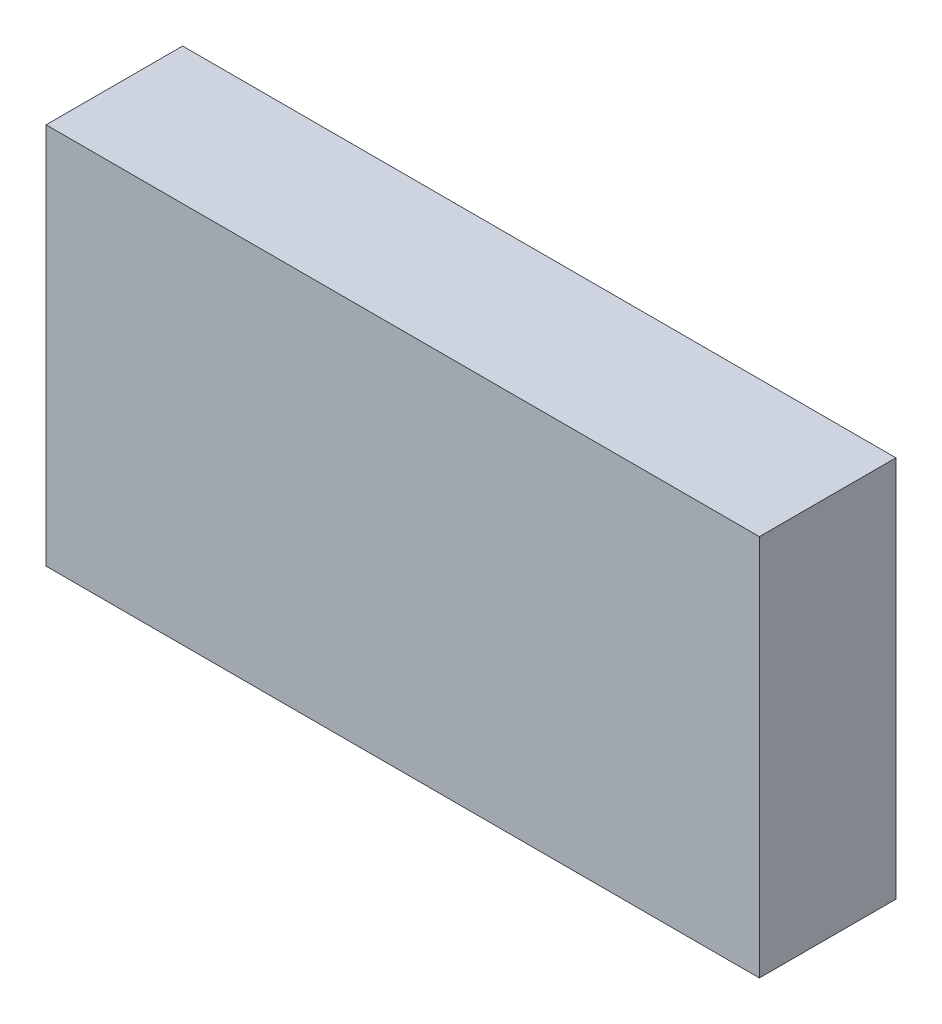
ISO-10303-21;
HEADER;
FILE_DESCRIPTION(('STEP AP214'),'2;1');
FILE_NAME('part.step','',(''),(''),'','','');
FILE_SCHEMA(('AUTOMOTIVE_DESIGN { 1 0 10303 214 1 1 1 1 }'));
ENDSEC;
DATA;
#1=APPLICATION_CONTEXT('core data for automotive mechanical design processes');
#2=APPLICATION_PROTOCOL_DEFINITION('international standard','automotive_design',2000,#1);
#3=PRODUCT_CONTEXT('',#1,'mechanical');
#4=PRODUCT('Part','Part','',(#3));
#5=PRODUCT_RELATED_PRODUCT_CATEGORY('part','',(#4));
#6=PRODUCT_DEFINITION_FORMATION('','',#4);
#7=PRODUCT_DEFINITION_CONTEXT('part definition',#1,'design');
#8=PRODUCT_DEFINITION('design','',#6,#7);
#9=PRODUCT_DEFINITION_SHAPE('','',#8);
#10=(LENGTH_UNIT() NAMED_UNIT(*) SI_UNIT(.MILLI.,.METRE.));
#11=(NAMED_UNIT(*) PLANE_ANGLE_UNIT() SI_UNIT($,.RADIAN.));
#12=(NAMED_UNIT(*) SI_UNIT($,.STERADIAN.) SOLID_ANGLE_UNIT());
#13=UNCERTAINTY_MEASURE_WITH_UNIT(LENGTH_MEASURE(1.E-05),#10,'distance_accuracy_value','');
#14=(GEOMETRIC_REPRESENTATION_CONTEXT(3) GLOBAL_UNCERTAINTY_ASSIGNED_CONTEXT((#13)) GLOBAL_UNIT_ASSIGNED_CONTEXT((#10,
#11,#12)) REPRESENTATION_CONTEXT('',''));
#15=CARTESIAN_POINT('',(0.,0.,0.));
#16=DIRECTION('',(0.,0.,1.));
#17=DIRECTION('',(1.,0.,0.));
#18=AXIS2_PLACEMENT_3D('',#15,#16,#17);
#19=CARTESIAN_POINT('',(-5.2250086,-2.79999948,2.));
#20=DIRECTION('',(0.,0.,-1.));
#21=DIRECTION('',(-1.,0.,0.));
#22=AXIS2_PLACEMENT_3D('',#19,#20,#21);
#23=PLANE('',#22);
#24=DIRECTION('',(0.,1.,0.));
#25=VECTOR('',#24,1.);
#26=CARTESIAN_POINT('',(5.22501114,-2.79999948,2.));
#27=LINE('',#26,#25);
#28=CARTESIAN_POINT('',(5.22501114,-2.79999948,2.));
#29=VERTEX_POINT('',#28);
#30=CARTESIAN_POINT('',(5.22501114,2.79999948,2.));
#31=VERTEX_POINT('',#30);
#32=EDGE_CURVE('E55',#29,#31,#27,.T.);
#33=ORIENTED_EDGE('',*,*,#32,.T.);
#34=DIRECTION('',(1.,0.,0.));
#35=VECTOR('',#34,1.);
#36=CARTESIAN_POINT('',(5.22501114,2.79999948,2.));
#37=LINE('',#36,#35);
#38=CARTESIAN_POINT('',(-5.2250086,2.79999948,2.));
#39=VERTEX_POINT('',#38);
#40=EDGE_CURVE('E57',#31,#39,#37,.F.);
#41=ORIENTED_EDGE('',*,*,#40,.T.);
#42=DIRECTION('',(0.,1.,0.));
#43=VECTOR('',#42,1.);
#44=CARTESIAN_POINT('',(-5.2250086,2.79999948,2.));
#45=LINE('',#44,#43);
#46=CARTESIAN_POINT('',(-5.2250086,-2.79999948,2.));
#47=VERTEX_POINT('',#46);
#48=EDGE_CURVE('E20',#39,#47,#45,.F.);
#49=ORIENTED_EDGE('',*,*,#48,.T.);
#50=DIRECTION('',(1.,0.,0.));
#51=VECTOR('',#50,1.);
#52=CARTESIAN_POINT('',(-5.2250086,-2.79999948,2.));
#53=LINE('',#52,#51);
#54=EDGE_CURVE('E80',#47,#29,#53,.T.);
#55=ORIENTED_EDGE('',*,*,#54,.T.);
#56=EDGE_LOOP('',(#33,#41,#49,#55));
#57=FACE_BOUND('',#56,.T.);
#58=ADVANCED_FACE('F17',(#57),#23,.F.);
#59=CARTESIAN_POINT('',(-5.2250086,2.79999948,0.));
#60=DIRECTION('',(1.,0.,0.));
#61=DIRECTION('',(0.,0.,-1.));
#62=AXIS2_PLACEMENT_3D('',#59,#60,#61);
#63=PLANE('',#62);
#64=DIRECTION('',(0.,0.,1.));
#65=VECTOR('',#64,1.);
#66=CARTESIAN_POINT('',(-5.2250086,-2.79999948,0.));
#67=LINE('',#66,#65);
#68=CARTESIAN_POINT('',(-5.2250086,-2.79999948,0.));
#69=VERTEX_POINT('',#68);
#70=EDGE_CURVE('E68',#69,#47,#67,.T.);
#71=ORIENTED_EDGE('',*,*,#70,.T.);
#72=ORIENTED_EDGE('',*,*,#48,.F.);
#73=DIRECTION('',(0.,0.,-1.));
#74=VECTOR('',#73,1.);
#75=CARTESIAN_POINT('',(-5.2250086,2.79999948,0.));
#76=LINE('',#75,#74);
#77=CARTESIAN_POINT('',(-5.2250086,2.79999948,0.));
#78=VERTEX_POINT('',#77);
#79=EDGE_CURVE('E63',#39,#78,#76,.T.);
#80=ORIENTED_EDGE('',*,*,#79,.T.);
#81=DIRECTION('',(0.,1.,0.));
#82=VECTOR('',#81,1.);
#83=CARTESIAN_POINT('',(-5.2250086,-2.79999948,0.));
#84=LINE('',#83,#82);
#85=EDGE_CURVE('E83',#69,#78,#84,.T.);
#86=ORIENTED_EDGE('',*,*,#85,.F.);
#87=EDGE_LOOP('',(#71,#72,#80,#86));
#88=FACE_BOUND('',#87,.T.);
#89=ADVANCED_FACE('F65',(#88),#63,.F.);
#90=CARTESIAN_POINT('',(5.22501114,2.79999948,0.));
#91=DIRECTION('',(0.,-1.,0.));
#92=DIRECTION('',(0.,0.,-1.));
#93=AXIS2_PLACEMENT_3D('',#90,#91,#92);
#94=PLANE('',#93);
#95=ORIENTED_EDGE('',*,*,#79,.F.);
#96=ORIENTED_EDGE('',*,*,#40,.F.);
#97=DIRECTION('',(0.,0.,1.));
#98=VECTOR('',#97,1.);
#99=CARTESIAN_POINT('',(5.22501114,2.79999948,0.));
#100=LINE('',#99,#98);
#101=CARTESIAN_POINT('',(5.22501114,2.79999948,0.));
#102=VERTEX_POINT('',#101);
#103=EDGE_CURVE('E75',#31,#102,#100,.F.);
#104=ORIENTED_EDGE('',*,*,#103,.T.);
#105=DIRECTION('',(-1.,0.,0.));
#106=VECTOR('',#105,1.);
#107=CARTESIAN_POINT('',(-5.2250086,2.79999948,0.));
#108=LINE('',#107,#106);
#109=EDGE_CURVE('E72',#78,#102,#108,.F.);
#110=ORIENTED_EDGE('',*,*,#109,.F.);
#111=EDGE_LOOP('',(#95,#96,#104,#110));
#112=FACE_BOUND('',#111,.T.);
#113=ADVANCED_FACE('F70',(#112),#94,.F.);
#114=CARTESIAN_POINT('',(5.22501114,-2.79999948,0.));
#115=DIRECTION('',(-1.,0.,0.));
#116=DIRECTION('',(0.,0.,1.));
#117=AXIS2_PLACEMENT_3D('',#114,#115,#116);
#118=PLANE('',#117);
#119=ORIENTED_EDGE('',*,*,#103,.F.);
#120=ORIENTED_EDGE('',*,*,#32,.F.);
#121=DIRECTION('',(0.,0.,1.));
#122=VECTOR('',#121,1.);
#123=CARTESIAN_POINT('',(5.22501114,-2.79999948,0.));
#124=LINE('',#123,#122);
#125=CARTESIAN_POINT('',(5.22501114,-2.79999948,0.));
#126=VERTEX_POINT('',#125);
#127=EDGE_CURVE('E35',#29,#126,#124,.F.);
#128=ORIENTED_EDGE('',*,*,#127,.T.);
#129=DIRECTION('',(0.,1.,0.));
#130=VECTOR('',#129,1.);
#131=CARTESIAN_POINT('',(5.22501114,-2.79999948,0.));
#132=LINE('',#131,#130);
#133=EDGE_CURVE('E26',#102,#126,#132,.F.);
#134=ORIENTED_EDGE('',*,*,#133,.F.);
#135=EDGE_LOOP('',(#119,#120,#128,#134));
#136=FACE_BOUND('',#135,.T.);
#137=ADVANCED_FACE('F89',(#136),#118,.F.);
#138=CARTESIAN_POINT('',(-5.2250086,-2.79999948,0.));
#139=DIRECTION('',(0.,1.,0.));
#140=DIRECTION('',(0.,0.,1.));
#141=AXIS2_PLACEMENT_3D('',#138,#139,#140);
#142=PLANE('',#141);
#143=ORIENTED_EDGE('',*,*,#127,.F.);
#144=ORIENTED_EDGE('',*,*,#54,.F.);
#145=ORIENTED_EDGE('',*,*,#70,.F.);
#146=DIRECTION('',(-1.,0.,0.));
#147=VECTOR('',#146,1.);
#148=CARTESIAN_POINT('',(-5.2250086,-2.79999948,0.));
#149=LINE('',#148,#147);
#150=EDGE_CURVE('E11',#126,#69,#149,.T.);
#151=ORIENTED_EDGE('',*,*,#150,.F.);
#152=EDGE_LOOP('',(#143,#144,#145,#151));
#153=FACE_BOUND('',#152,.T.);
#154=ADVANCED_FACE('F91',(#153),#142,.F.);
#155=CARTESIAN_POINT('',(-5.2250086,-2.79999948,0.));
#156=DIRECTION('',(0.,0.,-1.));
#157=DIRECTION('',(-1.,0.,0.));
#158=AXIS2_PLACEMENT_3D('',#155,#156,#157);
#159=PLANE('',#158);
#160=ORIENTED_EDGE('',*,*,#133,.T.);
#161=ORIENTED_EDGE('',*,*,#150,.T.);
#162=ORIENTED_EDGE('',*,*,#85,.T.);
#163=ORIENTED_EDGE('',*,*,#109,.T.);
#164=EDGE_LOOP('',(#160,#161,#162,#163));
#165=FACE_BOUND('',#164,.T.);
#166=ADVANCED_FACE('F88',(#165),#159,.T.);
#167=CLOSED_SHELL('',(#58,#89,#113,#137,#154,#166));
#168=MANIFOLD_SOLID_BREP('B1',#167);
#169=ADVANCED_BREP_SHAPE_REPRESENTATION('',(#18,#168),#14);
#170=SHAPE_DEFINITION_REPRESENTATION(#9,#169);
ENDSEC;
END-ISO-10303-21;
